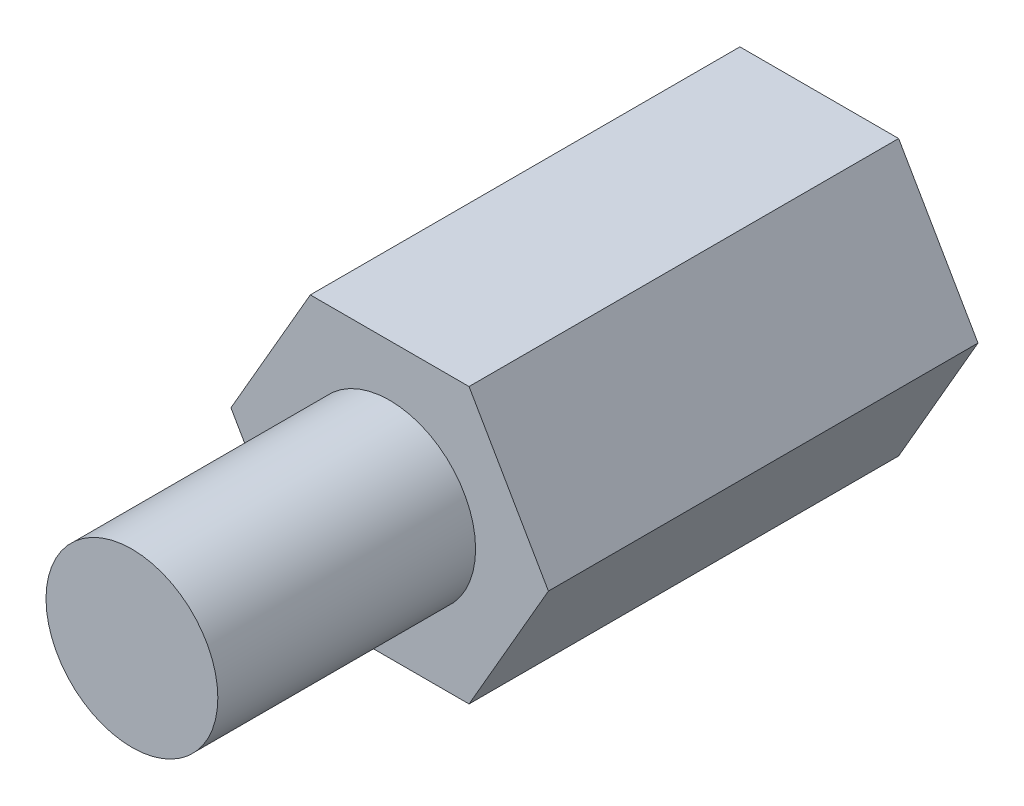
ISO-10303-21;
HEADER;
FILE_DESCRIPTION(('STEP AP214'),'2;1');
FILE_NAME('part.step','',(''),(''),'','','');
FILE_SCHEMA(('AUTOMOTIVE_DESIGN { 1 0 10303 214 1 1 1 1 }'));
ENDSEC;
DATA;
#1=APPLICATION_CONTEXT('core data for automotive mechanical design processes');
#2=APPLICATION_PROTOCOL_DEFINITION('international standard','automotive_design',2000,#1);
#3=PRODUCT_CONTEXT('',#1,'mechanical');
#4=PRODUCT('Part','Part','',(#3));
#5=PRODUCT_RELATED_PRODUCT_CATEGORY('part','',(#4));
#6=PRODUCT_DEFINITION_FORMATION('','',#4);
#7=PRODUCT_DEFINITION_CONTEXT('part definition',#1,'design');
#8=PRODUCT_DEFINITION('design','',#6,#7);
#9=PRODUCT_DEFINITION_SHAPE('','',#8);
#10=(LENGTH_UNIT() NAMED_UNIT(*) SI_UNIT(.MILLI.,.METRE.));
#11=(NAMED_UNIT(*) PLANE_ANGLE_UNIT() SI_UNIT($,.RADIAN.));
#12=(NAMED_UNIT(*) SI_UNIT($,.STERADIAN.) SOLID_ANGLE_UNIT());
#13=UNCERTAINTY_MEASURE_WITH_UNIT(LENGTH_MEASURE(1.E-05),#10,'distance_accuracy_value','');
#14=(GEOMETRIC_REPRESENTATION_CONTEXT(3) GLOBAL_UNCERTAINTY_ASSIGNED_CONTEXT((#13)) GLOBAL_UNIT_ASSIGNED_CONTEXT((#10,
#11,#12)) REPRESENTATION_CONTEXT('',''));
#15=CARTESIAN_POINT('',(0.,0.,0.));
#16=DIRECTION('',(0.,0.,1.));
#17=DIRECTION('',(1.,0.,0.));
#18=AXIS2_PLACEMENT_3D('',#15,#16,#17);
#19=CARTESIAN_POINT('',(-2.7712812921102,-1.6,5.));
#20=DIRECTION('',(0.,0.,-1.));
#21=DIRECTION('',(-1.,0.,0.));
#22=AXIS2_PLACEMENT_3D('',#19,#20,#21);
#23=PLANE('',#22);
#24=DIRECTION('',(1.,0.,0.));
#25=VECTOR('',#24,1.);
#26=CARTESIAN_POINT('',(-0.923760430703401,-1.6,5.));
#27=LINE('',#26,#25);
#28=CARTESIAN_POINT('',(-0.923760430703401,-1.6,5.));
#29=VERTEX_POINT('',#28);
#30=CARTESIAN_POINT('',(0.923760430703402,-1.6,5.));
#31=VERTEX_POINT('',#30);
#32=EDGE_CURVE('E136',#29,#31,#27,.T.);
#33=ORIENTED_EDGE('',*,*,#32,.T.);
#34=DIRECTION('',(0.5,0.866025403784439,0.));
#35=VECTOR('',#34,1.);
#36=CARTESIAN_POINT('',(0.923760430703402,-1.6,5.));
#37=LINE('',#36,#35);
#38=CARTESIAN_POINT('',(1.8475208614068,0.,5.));
#39=VERTEX_POINT('',#38);
#40=EDGE_CURVE('E93',#31,#39,#37,.T.);
#41=ORIENTED_EDGE('',*,*,#40,.T.);
#42=DIRECTION('',(-0.5,0.866025403784439,0.));
#43=VECTOR('',#42,1.);
#44=CARTESIAN_POINT('',(1.8475208614068,0.,5.));
#45=LINE('',#44,#43);
#46=CARTESIAN_POINT('',(0.923760430703402,1.6,5.));
#47=VERTEX_POINT('',#46);
#48=EDGE_CURVE('E107',#39,#47,#45,.T.);
#49=ORIENTED_EDGE('',*,*,#48,.T.);
#50=DIRECTION('',(-1.,0.,0.));
#51=VECTOR('',#50,1.);
#52=CARTESIAN_POINT('',(0.923760430703402,1.6,5.));
#53=LINE('',#52,#51);
#54=CARTESIAN_POINT('',(-0.923760430703402,1.6,5.));
#55=VERTEX_POINT('',#54);
#56=EDGE_CURVE('E101',#47,#55,#53,.T.);
#57=ORIENTED_EDGE('',*,*,#56,.T.);
#58=DIRECTION('',(-0.5,-0.866025403784439,0.));
#59=VECTOR('',#58,1.);
#60=CARTESIAN_POINT('',(-0.923760430703402,1.6,5.));
#61=LINE('',#60,#59);
#62=CARTESIAN_POINT('',(-1.8475208614068,0.,5.));
#63=VERTEX_POINT('',#62);
#64=EDGE_CURVE('E105',#55,#63,#61,.T.);
#65=ORIENTED_EDGE('',*,*,#64,.T.);
#66=DIRECTION('',(0.5,-0.866025403784439,0.));
#67=VECTOR('',#66,1.);
#68=CARTESIAN_POINT('',(-1.8475208614068,0.,5.));
#69=LINE('',#68,#67);
#70=EDGE_CURVE('E54',#63,#29,#69,.T.);
#71=ORIENTED_EDGE('',*,*,#70,.T.);
#72=EDGE_LOOP('',(#33,#41,#49,#57,#65,#71));
#73=FACE_BOUND('',#72,.T.);
#74=CARTESIAN_POINT('',(0.,0.,5.));
#75=DIRECTION('',(0.,0.,-1.));
#76=DIRECTION('',(-1.,0.,0.));
#77=AXIS2_PLACEMENT_3D('',#74,#75,#76);
#78=CIRCLE('',#77,1.);
#79=CARTESIAN_POINT('',(-1.,0.,5.));
#80=VERTEX_POINT('',#79);
#81=EDGE_CURVE('E11',#80,#80,#78,.F.);
#82=ORIENTED_EDGE('',*,*,#81,.F.);
#83=EDGE_LOOP('',(#82));
#84=FACE_BOUND('',#83,.T.);
#85=ADVANCED_FACE('F37',(#73,#84),#23,.F.);
#86=CARTESIAN_POINT('',(-0.923760430703401,-1.6,5.));
#87=DIRECTION('',(0.,1.,0.));
#88=DIRECTION('',(-1.,0.,0.));
#89=AXIS2_PLACEMENT_3D('',#86,#87,#88);
#90=PLANE('',#89);
#91=DIRECTION('',(1.,0.,0.));
#92=VECTOR('',#91,1.);
#93=CARTESIAN_POINT('',(-0.923760430703401,-1.6,0.));
#94=LINE('',#93,#92);
#95=CARTESIAN_POINT('',(-0.923760430703401,-1.6,0.));
#96=VERTEX_POINT('',#95);
#97=CARTESIAN_POINT('',(0.923760430703402,-1.6,0.));
#98=VERTEX_POINT('',#97);
#99=EDGE_CURVE('E125',#96,#98,#94,.T.);
#100=ORIENTED_EDGE('',*,*,#99,.T.);
#101=DIRECTION('',(0.,0.,-1.));
#102=VECTOR('',#101,1.);
#103=CARTESIAN_POINT('',(0.923760430703402,-1.6,5.));
#104=LINE('',#103,#102);
#105=EDGE_CURVE('E46',#31,#98,#104,.T.);
#106=ORIENTED_EDGE('',*,*,#105,.F.);
#107=ORIENTED_EDGE('',*,*,#32,.F.);
#108=DIRECTION('',(0.,0.,-1.));
#109=VECTOR('',#108,1.);
#110=CARTESIAN_POINT('',(-0.923760430703401,-1.6,5.));
#111=LINE('',#110,#109);
#112=EDGE_CURVE('E121',#29,#96,#111,.T.);
#113=ORIENTED_EDGE('',*,*,#112,.T.);
#114=EDGE_LOOP('',(#100,#106,#107,#113));
#115=FACE_BOUND('',#114,.T.);
#116=ADVANCED_FACE('F39',(#115),#90,.F.);
#117=CARTESIAN_POINT('',(0.923760430703402,-1.6,5.));
#118=DIRECTION('',(-0.866025403784439,0.5,0.));
#119=DIRECTION('',(-0.5,-0.866025403784439,0.));
#120=AXIS2_PLACEMENT_3D('',#117,#118,#119);
#121=PLANE('',#120);
#122=DIRECTION('',(0.5,0.866025403784439,0.));
#123=VECTOR('',#122,1.);
#124=CARTESIAN_POINT('',(0.923760430703402,-1.6,0.));
#125=LINE('',#124,#123);
#126=CARTESIAN_POINT('',(1.8475208614068,0.,0.));
#127=VERTEX_POINT('',#126);
#128=EDGE_CURVE('E128',#98,#127,#125,.T.);
#129=ORIENTED_EDGE('',*,*,#128,.T.);
#130=DIRECTION('',(0.,0.,-1.));
#131=VECTOR('',#130,1.);
#132=CARTESIAN_POINT('',(1.8475208614068,0.,5.));
#133=LINE('',#132,#131);
#134=EDGE_CURVE('E140',#39,#127,#133,.T.);
#135=ORIENTED_EDGE('',*,*,#134,.F.);
#136=ORIENTED_EDGE('',*,*,#40,.F.);
#137=ORIENTED_EDGE('',*,*,#105,.T.);
#138=EDGE_LOOP('',(#129,#135,#136,#137));
#139=FACE_BOUND('',#138,.T.);
#140=ADVANCED_FACE('F143',(#139),#121,.F.);
#141=CARTESIAN_POINT('',(1.8475208614068,0.,5.));
#142=DIRECTION('',(-0.866025403784438,-0.5,0.));
#143=DIRECTION('',(0.5,-0.866025403784439,0.));
#144=AXIS2_PLACEMENT_3D('',#141,#142,#143);
#145=PLANE('',#144);
#146=DIRECTION('',(-0.5,0.866025403784439,0.));
#147=VECTOR('',#146,1.);
#148=CARTESIAN_POINT('',(1.8475208614068,0.,0.));
#149=LINE('',#148,#147);
#150=CARTESIAN_POINT('',(0.923760430703402,1.6,0.));
#151=VERTEX_POINT('',#150);
#152=EDGE_CURVE('E131',#127,#151,#149,.T.);
#153=ORIENTED_EDGE('',*,*,#152,.T.);
#154=DIRECTION('',(0.,0.,-1.));
#155=VECTOR('',#154,1.);
#156=CARTESIAN_POINT('',(0.923760430703402,1.6,5.));
#157=LINE('',#156,#155);
#158=EDGE_CURVE('E116',#47,#151,#157,.T.);
#159=ORIENTED_EDGE('',*,*,#158,.F.);
#160=ORIENTED_EDGE('',*,*,#48,.F.);
#161=ORIENTED_EDGE('',*,*,#134,.T.);
#162=EDGE_LOOP('',(#153,#159,#160,#161));
#163=FACE_BOUND('',#162,.T.);
#164=ADVANCED_FACE('F151',(#163),#145,.F.);
#165=CARTESIAN_POINT('',(0.923760430703402,1.6,5.));
#166=DIRECTION('',(0.,-1.,0.));
#167=DIRECTION('',(1.,0.,0.));
#168=AXIS2_PLACEMENT_3D('',#165,#166,#167);
#169=PLANE('',#168);
#170=DIRECTION('',(-1.,0.,0.));
#171=VECTOR('',#170,1.);
#172=CARTESIAN_POINT('',(0.923760430703402,1.6,0.));
#173=LINE('',#172,#171);
#174=CARTESIAN_POINT('',(-0.923760430703402,1.6,0.));
#175=VERTEX_POINT('',#174);
#176=EDGE_CURVE('E115',#151,#175,#173,.T.);
#177=ORIENTED_EDGE('',*,*,#176,.T.);
#178=DIRECTION('',(0.,0.,-1.));
#179=VECTOR('',#178,1.);
#180=CARTESIAN_POINT('',(-0.923760430703402,1.6,5.));
#181=LINE('',#180,#179);
#182=EDGE_CURVE('E112',#55,#175,#181,.T.);
#183=ORIENTED_EDGE('',*,*,#182,.F.);
#184=ORIENTED_EDGE('',*,*,#56,.F.);
#185=ORIENTED_EDGE('',*,*,#158,.T.);
#186=EDGE_LOOP('',(#177,#183,#184,#185));
#187=FACE_BOUND('',#186,.T.);
#188=ADVANCED_FACE('F113',(#187),#169,.F.);
#189=CARTESIAN_POINT('',(-0.923760430703402,1.6,5.));
#190=DIRECTION('',(0.866025403784439,-0.5,0.));
#191=DIRECTION('',(0.5,0.866025403784439,0.));
#192=AXIS2_PLACEMENT_3D('',#189,#190,#191);
#193=PLANE('',#192);
#194=DIRECTION('',(-0.5,-0.866025403784439,0.));
#195=VECTOR('',#194,1.);
#196=CARTESIAN_POINT('',(-0.923760430703402,1.6,0.));
#197=LINE('',#196,#195);
#198=CARTESIAN_POINT('',(-1.8475208614068,0.,0.));
#199=VERTEX_POINT('',#198);
#200=EDGE_CURVE('E78',#175,#199,#197,.T.);
#201=ORIENTED_EDGE('',*,*,#200,.T.);
#202=DIRECTION('',(0.,0.,-1.));
#203=VECTOR('',#202,1.);
#204=CARTESIAN_POINT('',(-1.8475208614068,0.,5.));
#205=LINE('',#204,#203);
#206=EDGE_CURVE('E117',#63,#199,#205,.T.);
#207=ORIENTED_EDGE('',*,*,#206,.F.);
#208=ORIENTED_EDGE('',*,*,#64,.F.);
#209=ORIENTED_EDGE('',*,*,#182,.T.);
#210=EDGE_LOOP('',(#201,#207,#208,#209));
#211=FACE_BOUND('',#210,.T.);
#212=ADVANCED_FACE('F119',(#211),#193,.F.);
#213=CARTESIAN_POINT('',(-1.8475208614068,0.,5.));
#214=DIRECTION('',(0.866025403784439,0.5,0.));
#215=DIRECTION('',(-0.5,0.866025403784439,0.));
#216=AXIS2_PLACEMENT_3D('',#213,#214,#215);
#217=PLANE('',#216);
#218=DIRECTION('',(0.5,-0.866025403784439,0.));
#219=VECTOR('',#218,1.);
#220=CARTESIAN_POINT('',(-1.8475208614068,0.,0.));
#221=LINE('',#220,#219);
#222=EDGE_CURVE('E84',#199,#96,#221,.T.);
#223=ORIENTED_EDGE('',*,*,#222,.T.);
#224=ORIENTED_EDGE('',*,*,#112,.F.);
#225=ORIENTED_EDGE('',*,*,#70,.F.);
#226=ORIENTED_EDGE('',*,*,#206,.T.);
#227=EDGE_LOOP('',(#223,#224,#225,#226));
#228=FACE_BOUND('',#227,.T.);
#229=ADVANCED_FACE('F175',(#228),#217,.F.);
#230=CARTESIAN_POINT('',(-2.7712812921102,-1.6,0.));
#231=DIRECTION('',(0.,0.,-1.));
#232=DIRECTION('',(-1.,0.,0.));
#233=AXIS2_PLACEMENT_3D('',#230,#231,#232);
#234=PLANE('',#233);
#235=CARTESIAN_POINT('',(0.,0.,0.));
#236=DIRECTION('',(0.,0.,-1.));
#237=DIRECTION('',(-1.,0.,0.));
#238=AXIS2_PLACEMENT_3D('',#235,#236,#237);
#239=CIRCLE('',#238,0.799999999999999);
#240=CARTESIAN_POINT('',(-0.799999999999999,0.,0.));
#241=VERTEX_POINT('',#240);
#242=EDGE_CURVE('E157',#241,#241,#239,.T.);
#243=ORIENTED_EDGE('',*,*,#242,.F.);
#244=EDGE_LOOP('',(#243));
#245=FACE_BOUND('',#244,.T.);
#246=ORIENTED_EDGE('',*,*,#99,.F.);
#247=ORIENTED_EDGE('',*,*,#222,.F.);
#248=ORIENTED_EDGE('',*,*,#200,.F.);
#249=ORIENTED_EDGE('',*,*,#176,.F.);
#250=ORIENTED_EDGE('',*,*,#152,.F.);
#251=ORIENTED_EDGE('',*,*,#128,.F.);
#252=EDGE_LOOP('',(#246,#247,#248,#249,#250,#251));
#253=FACE_BOUND('',#252,.T.);
#254=ADVANCED_FACE('F148',(#245,#253),#234,.T.);
#255=CARTESIAN_POINT('',(0.,0.,8.));
#256=DIRECTION('',(0.,0.,-1.));
#257=DIRECTION('',(-1.,0.,0.));
#258=AXIS2_PLACEMENT_3D('',#255,#256,#257);
#259=CYLINDRICAL_SURFACE('',#258,1.);
#260=CARTESIAN_POINT('',(0.,0.,8.));
#261=DIRECTION('',(0.,0.,1.));
#262=DIRECTION('',(1.,0.,0.));
#263=AXIS2_PLACEMENT_3D('',#260,#261,#262);
#264=CIRCLE('',#263,1.);
#265=CARTESIAN_POINT('',(1.,0.,8.));
#266=VERTEX_POINT('',#265);
#267=EDGE_CURVE('E129',#266,#266,#264,.T.);
#268=ORIENTED_EDGE('',*,*,#267,.F.);
#269=EDGE_LOOP('',(#268));
#270=FACE_BOUND('',#269,.T.);
#271=ORIENTED_EDGE('',*,*,#81,.T.);
#272=EDGE_LOOP('',(#271));
#273=FACE_BOUND('',#272,.T.);
#274=ADVANCED_FACE('F174',(#270,#273),#259,.T.);
#275=CARTESIAN_POINT('',(0.,0.,8.));
#276=DIRECTION('',(0.,0.,1.));
#277=DIRECTION('',(1.,0.,0.));
#278=AXIS2_PLACEMENT_3D('',#275,#276,#277);
#279=PLANE('',#278);
#280=ORIENTED_EDGE('',*,*,#267,.T.);
#281=EDGE_LOOP('',(#280));
#282=FACE_BOUND('',#281,.T.);
#283=ADVANCED_FACE('F169',(#282),#279,.T.);
#284=CARTESIAN_POINT('',(0.,0.,0.));
#285=DIRECTION('',(0.,0.,-1.));
#286=DIRECTION('',(-1.,0.,0.));
#287=AXIS2_PLACEMENT_3D('',#284,#285,#286);
#288=CYLINDRICAL_SURFACE('',#287,0.799999999999999);
#289=CARTESIAN_POINT('',(0.,0.,6.));
#290=DIRECTION('',(0.,0.,-1.));
#291=DIRECTION('',(-1.,0.,0.));
#292=AXIS2_PLACEMENT_3D('',#289,#290,#291);
#293=CIRCLE('',#292,0.799999999999998);
#294=CARTESIAN_POINT('',(-0.799999999999998,0.,6.));
#295=VERTEX_POINT('',#294);
#296=EDGE_CURVE('E160',#295,#295,#293,.T.);
#297=ORIENTED_EDGE('',*,*,#296,.F.);
#298=EDGE_LOOP('',(#297));
#299=FACE_BOUND('',#298,.T.);
#300=ORIENTED_EDGE('',*,*,#242,.T.);
#301=EDGE_LOOP('',(#300));
#302=FACE_BOUND('',#301,.T.);
#303=ADVANCED_FACE('F166',(#299,#302),#288,.F.);
#304=CARTESIAN_POINT('',(0.,0.,6.));
#305=DIRECTION('',(0.,0.,-1.));
#306=DIRECTION('',(-1.,0.,0.));
#307=AXIS2_PLACEMENT_3D('',#304,#305,#306);
#308=CONICAL_SURFACE('',#307,0.799999999999998,1.02974425867665);
#309=CARTESIAN_POINT('',(0.,0.,6.48068849522205));
#310=VERTEX_POINT('',#309);
#311=VERTEX_LOOP('',#310);
#312=FACE_BOUND('',#311,.T.);
#313=ORIENTED_EDGE('',*,*,#296,.T.);
#314=EDGE_LOOP('',(#313));
#315=FACE_BOUND('',#314,.T.);
#316=ADVANCED_FACE('F164',(#312,#315),#308,.F.);
#317=CLOSED_SHELL('',(#85,#116,#140,#164,#188,#212,#229,#254,#274,#283,#303,#316));
#318=MANIFOLD_SOLID_BREP('B2',#317);
#319=ADVANCED_BREP_SHAPE_REPRESENTATION('',(#18,#318),#14);
#320=SHAPE_DEFINITION_REPRESENTATION(#9,#319);
ENDSEC;
END-ISO-10303-21;
